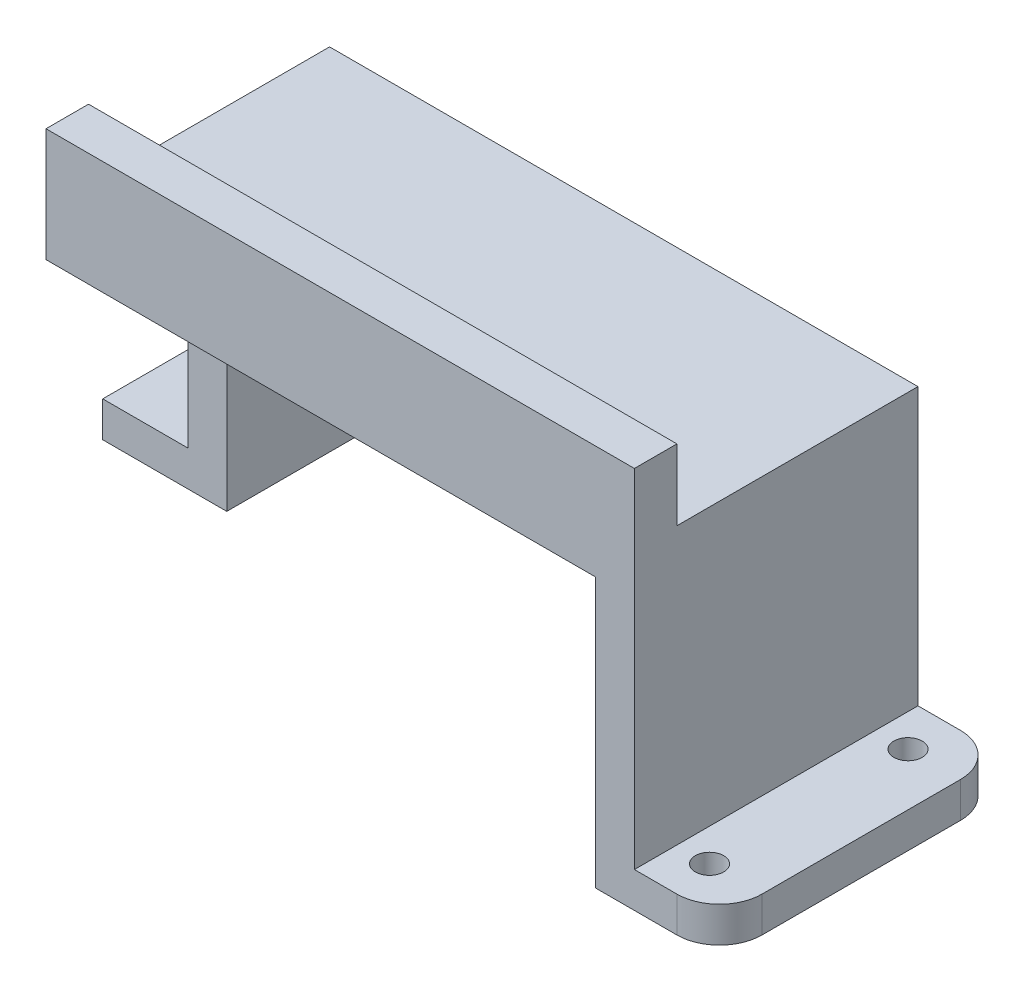
ISO-10303-21;
HEADER;
FILE_DESCRIPTION(('STEP AP214'),'2;1');
FILE_NAME('part.step','',(''),(''),'','','');
FILE_SCHEMA(('AUTOMOTIVE_DESIGN { 1 0 10303 214 1 1 1 1 }'));
ENDSEC;
DATA;
#1=APPLICATION_CONTEXT('core data for automotive mechanical design processes');
#2=APPLICATION_PROTOCOL_DEFINITION('international standard','automotive_design',2000,#1);
#3=PRODUCT_CONTEXT('',#1,'mechanical');
#4=PRODUCT('Part','Part','',(#3));
#5=PRODUCT_RELATED_PRODUCT_CATEGORY('part','',(#4));
#6=PRODUCT_DEFINITION_FORMATION('','',#4);
#7=PRODUCT_DEFINITION_CONTEXT('part definition',#1,'design');
#8=PRODUCT_DEFINITION('design','',#6,#7);
#9=PRODUCT_DEFINITION_SHAPE('','',#8);
#10=(LENGTH_UNIT() NAMED_UNIT(*) SI_UNIT(.MILLI.,.METRE.));
#11=(NAMED_UNIT(*) PLANE_ANGLE_UNIT() SI_UNIT($,.RADIAN.));
#12=(NAMED_UNIT(*) SI_UNIT($,.STERADIAN.) SOLID_ANGLE_UNIT());
#13=UNCERTAINTY_MEASURE_WITH_UNIT(LENGTH_MEASURE(1.E-05),#10,'distance_accuracy_value','');
#14=(GEOMETRIC_REPRESENTATION_CONTEXT(3) GLOBAL_UNCERTAINTY_ASSIGNED_CONTEXT((#13)) GLOBAL_UNIT_ASSIGNED_CONTEXT((#10,
#11,#12)) REPRESENTATION_CONTEXT('',''));
#15=CARTESIAN_POINT('',(0.,0.,0.));
#16=DIRECTION('',(0.,0.,1.));
#17=DIRECTION('',(1.,0.,0.));
#18=AXIS2_PLACEMENT_3D('',#15,#16,#17);
#19=CARTESIAN_POINT('',(-19.75,-20.,33.5));
#20=DIRECTION('',(0.,1.,0.));
#21=DIRECTION('',(0.,0.,1.));
#22=AXIS2_PLACEMENT_3D('',#19,#20,#21);
#23=PLANE('',#22);
#24=CARTESIAN_POINT('',(-22.05,-20.,16.5));
#25=DIRECTION('',(0.,1.,0.));
#26=DIRECTION('',(0.,0.,1.));
#27=AXIS2_PLACEMENT_3D('',#24,#25,#26);
#28=CIRCLE('',#27,1.);
#29=CARTESIAN_POINT('',(-22.05,-20.,17.5));
#30=VERTEX_POINT('',#29);
#31=EDGE_CURVE('E197',#30,#30,#28,.F.);
#32=ORIENTED_EDGE('',*,*,#31,.F.);
#33=EDGE_LOOP('',(#32));
#34=FACE_BOUND('',#33,.T.);
#35=DIRECTION('',(1.,0.,0.));
#36=VECTOR('',#35,1.);
#37=CARTESIAN_POINT('',(-25.75,-20.,13.5));
#38=LINE('',#37,#36);
#39=CARTESIAN_POINT('',(-22.75,-20.,13.5));
#40=VERTEX_POINT('',#39);
#41=CARTESIAN_POINT('',(-17.,-20.,13.5));
#42=VERTEX_POINT('',#41);
#43=EDGE_CURVE('E192',#40,#42,#38,.T.);
#44=ORIENTED_EDGE('',*,*,#43,.T.);
#45=DIRECTION('',(0.,0.,-1.));
#46=VECTOR('',#45,1.);
#47=CARTESIAN_POINT('',(-17.,-20.,33.5));
#48=LINE('',#47,#46);
#49=CARTESIAN_POINT('',(-17.,-20.,23.5));
#50=VERTEX_POINT('',#49);
#51=EDGE_CURVE('E299',#50,#42,#48,.T.);
#52=ORIENTED_EDGE('',*,*,#51,.F.);
#53=DIRECTION('',(1.,0.,0.));
#54=VECTOR('',#53,1.);
#55=CARTESIAN_POINT('',(-17.,-20.,23.5));
#56=LINE('',#55,#54);
#57=CARTESIAN_POINT('',(-25.75,-20.,23.5));
#58=VERTEX_POINT('',#57);
#59=EDGE_CURVE('E422',#58,#50,#56,.T.);
#60=ORIENTED_EDGE('',*,*,#59,.F.);
#61=DIRECTION('',(0.,0.,-1.));
#62=VECTOR('',#61,1.);
#63=CARTESIAN_POINT('',(-25.75,-20.,33.5));
#64=LINE('',#63,#62);
#65=CARTESIAN_POINT('',(-25.75,-20.,16.5));
#66=VERTEX_POINT('',#65);
#67=EDGE_CURVE('E59',#58,#66,#64,.T.);
#68=ORIENTED_EDGE('',*,*,#67,.T.);
#69=CARTESIAN_POINT('',(-22.75,-20.,16.5));
#70=DIRECTION('',(0.,1.,0.));
#71=DIRECTION('',(0.,0.,1.));
#72=AXIS2_PLACEMENT_3D('',#69,#70,#71);
#73=CIRCLE('',#72,3.);
#74=EDGE_CURVE('E45',#66,#40,#73,.F.);
#75=ORIENTED_EDGE('',*,*,#74,.T.);
#76=EDGE_LOOP('',(#44,#52,#60,#68,#75));
#77=FACE_BOUND('',#76,.T.);
#78=ADVANCED_FACE('F37',(#34,#77),#23,.F.);
#79=CARTESIAN_POINT('',(-25.75,-17.5,33.5));
#80=DIRECTION('',(0.,1.,0.));
#81=DIRECTION('',(0.,0.,1.));
#82=AXIS2_PLACEMENT_3D('',#79,#80,#81);
#83=PLANE('',#82);
#84=CARTESIAN_POINT('',(-22.05,-17.5,16.5));
#85=DIRECTION('',(0.,-1.,0.));
#86=DIRECTION('',(0.,0.,1.));
#87=AXIS2_PLACEMENT_3D('',#84,#85,#86);
#88=CIRCLE('',#87,1.);
#89=CARTESIAN_POINT('',(-22.05,-17.5,17.5));
#90=VERTEX_POINT('',#89);
#91=EDGE_CURVE('E201',#90,#90,#88,.T.);
#92=ORIENTED_EDGE('',*,*,#91,.T.);
#93=EDGE_LOOP('',(#92));
#94=FACE_BOUND('',#93,.T.);
#95=DIRECTION('',(0.,0.,1.));
#96=VECTOR('',#95,1.);
#97=CARTESIAN_POINT('',(-25.75,-17.5,33.5));
#98=LINE('',#97,#96);
#99=CARTESIAN_POINT('',(-25.75,-17.5,16.5));
#100=VERTEX_POINT('',#99);
#101=CARTESIAN_POINT('',(-25.75,-17.5,23.5));
#102=VERTEX_POINT('',#101);
#103=EDGE_CURVE('E193',#100,#102,#98,.T.);
#104=ORIENTED_EDGE('',*,*,#103,.T.);
#105=DIRECTION('',(1.,0.,0.));
#106=VECTOR('',#105,1.);
#107=CARTESIAN_POINT('',(-25.75,-17.5,23.5));
#108=LINE('',#107,#106);
#109=CARTESIAN_POINT('',(-19.75,-17.5,23.5));
#110=VERTEX_POINT('',#109);
#111=EDGE_CURVE('E51',#102,#110,#108,.T.);
#112=ORIENTED_EDGE('',*,*,#111,.T.);
#113=DIRECTION('',(0.,0.,1.));
#114=VECTOR('',#113,1.);
#115=CARTESIAN_POINT('',(-19.75,-17.5,33.5));
#116=LINE('',#115,#114);
#117=CARTESIAN_POINT('',(-19.75,-17.5,13.5));
#118=VERTEX_POINT('',#117);
#119=EDGE_CURVE('E176',#118,#110,#116,.T.);
#120=ORIENTED_EDGE('',*,*,#119,.F.);
#121=DIRECTION('',(1.,0.,0.));
#122=VECTOR('',#121,1.);
#123=CARTESIAN_POINT('',(-25.75,-17.5,13.5));
#124=LINE('',#123,#122);
#125=CARTESIAN_POINT('',(-22.75,-17.5,13.5));
#126=VERTEX_POINT('',#125);
#127=EDGE_CURVE('E185',#126,#118,#124,.T.);
#128=ORIENTED_EDGE('',*,*,#127,.F.);
#129=CARTESIAN_POINT('',(-22.75,-17.5,16.5));
#130=DIRECTION('',(0.,1.,0.));
#131=DIRECTION('',(0.,0.,1.));
#132=AXIS2_PLACEMENT_3D('',#129,#130,#131);
#133=CIRCLE('',#132,3.);
#134=EDGE_CURVE('E459',#126,#100,#133,.T.);
#135=ORIENTED_EDGE('',*,*,#134,.T.);
#136=EDGE_LOOP('',(#104,#112,#120,#128,#135));
#137=FACE_BOUND('',#136,.T.);
#138=ADVANCED_FACE('F196',(#94,#137),#83,.T.);
#139=CARTESIAN_POINT('',(-17.,-20.,33.5));
#140=DIRECTION('',(-1.,0.,0.));
#141=DIRECTION('',(0.,0.,1.));
#142=AXIS2_PLACEMENT_3D('',#139,#140,#141);
#143=PLANE('',#142);
#144=ORIENTED_EDGE('',*,*,#51,.T.);
#145=DIRECTION('',(0.,1.,0.));
#146=VECTOR('',#145,1.);
#147=CARTESIAN_POINT('',(-17.,-20.,13.5));
#148=LINE('',#147,#146);
#149=CARTESIAN_POINT('',(-17.,-0.999999999999999,13.5));
#150=VERTEX_POINT('',#149);
#151=EDGE_CURVE('E427',#42,#150,#148,.T.);
#152=ORIENTED_EDGE('',*,*,#151,.T.);
#153=DIRECTION('',(0.,0.,-1.));
#154=VECTOR('',#153,1.);
#155=CARTESIAN_POINT('',(-17.,-0.999999999999999,33.5));
#156=LINE('',#155,#154);
#157=CARTESIAN_POINT('',(-17.,-1.,23.5));
#158=VERTEX_POINT('',#157);
#159=EDGE_CURVE('E308',#158,#150,#156,.T.);
#160=ORIENTED_EDGE('',*,*,#159,.F.);
#161=DIRECTION('',(0.,1.,0.));
#162=VECTOR('',#161,1.);
#163=CARTESIAN_POINT('',(-17.,-20.,23.5));
#164=LINE('',#163,#162);
#165=EDGE_CURVE('E431',#50,#158,#164,.T.);
#166=ORIENTED_EDGE('',*,*,#165,.F.);
#167=EDGE_LOOP('',(#144,#152,#160,#166));
#168=FACE_BOUND('',#167,.T.);
#169=ADVANCED_FACE('F366',(#168),#143,.F.);
#170=CARTESIAN_POINT('',(-25.75,0.,0.));
#171=DIRECTION('',(1.,0.,0.));
#172=DIRECTION('',(0.,0.,1.));
#173=AXIS2_PLACEMENT_3D('',#170,#171,#172);
#174=PLANE('',#173);
#175=DIRECTION('',(0.,-1.,0.));
#176=VECTOR('',#175,1.);
#177=CARTESIAN_POINT('',(-25.75,0.,23.5));
#178=LINE('',#177,#176);
#179=EDGE_CURVE('E11',#102,#58,#178,.T.);
#180=ORIENTED_EDGE('',*,*,#179,.F.);
#181=ORIENTED_EDGE('',*,*,#103,.F.);
#182=DIRECTION('',(0.,1.,0.));
#183=VECTOR('',#182,1.);
#184=CARTESIAN_POINT('',(-25.75,-20.,16.5));
#185=LINE('',#184,#183);
#186=EDGE_CURVE('E461',#100,#66,#185,.F.);
#187=ORIENTED_EDGE('',*,*,#186,.T.);
#188=ORIENTED_EDGE('',*,*,#67,.F.);
#189=EDGE_LOOP('',(#180,#181,#187,#188));
#190=FACE_BOUND('',#189,.T.);
#191=ADVANCED_FACE('F379',(#190),#174,.F.);
#192=CARTESIAN_POINT('',(-19.75,2.,33.5));
#193=DIRECTION('',(0.,-1.,0.));
#194=DIRECTION('',(0.,0.,-1.));
#195=AXIS2_PLACEMENT_3D('',#192,#193,#194);
#196=PLANE('',#195);
#197=DIRECTION('',(0.,0.,-1.));
#198=VECTOR('',#197,1.);
#199=CARTESIAN_POINT('',(21.75,2.,33.5));
#200=LINE('',#199,#198);
#201=CARTESIAN_POINT('',(21.75,2.,30.5));
#202=VERTEX_POINT('',#201);
#203=CARTESIAN_POINT('',(21.75,2.,13.5));
#204=VERTEX_POINT('',#203);
#205=EDGE_CURVE('E234',#202,#204,#200,.T.);
#206=ORIENTED_EDGE('',*,*,#205,.T.);
#207=DIRECTION('',(-1.,0.,0.));
#208=VECTOR('',#207,1.);
#209=CARTESIAN_POINT('',(-19.75,2.,13.5));
#210=LINE('',#209,#208);
#211=CARTESIAN_POINT('',(-19.75,2.,13.5));
#212=VERTEX_POINT('',#211);
#213=EDGE_CURVE('E406',#204,#212,#210,.T.);
#214=ORIENTED_EDGE('',*,*,#213,.T.);
#215=DIRECTION('',(0.,0.,-1.));
#216=VECTOR('',#215,1.);
#217=CARTESIAN_POINT('',(-19.75,2.,33.5));
#218=LINE('',#217,#216);
#219=CARTESIAN_POINT('',(-19.75,2.,30.5));
#220=VERTEX_POINT('',#219);
#221=EDGE_CURVE('E178',#220,#212,#218,.T.);
#222=ORIENTED_EDGE('',*,*,#221,.F.);
#223=DIRECTION('',(-1.,0.,0.));
#224=VECTOR('',#223,1.);
#225=CARTESIAN_POINT('',(-19.75,2.,30.5));
#226=LINE('',#225,#224);
#227=EDGE_CURVE('E218',#202,#220,#226,.T.);
#228=ORIENTED_EDGE('',*,*,#227,.F.);
#229=EDGE_LOOP('',(#206,#214,#222,#228));
#230=FACE_BOUND('',#229,.T.);
#231=ADVANCED_FACE('F376',(#230),#196,.F.);
#232=CARTESIAN_POINT('',(21.75,-20.,33.5));
#233=DIRECTION('',(-1.,0.,0.));
#234=DIRECTION('',(0.,0.,1.));
#235=AXIS2_PLACEMENT_3D('',#232,#233,#234);
#236=PLANE('',#235);
#237=DIRECTION('',(0.,0.,1.));
#238=VECTOR('',#237,1.);
#239=CARTESIAN_POINT('',(21.75,-17.5,33.5));
#240=LINE('',#239,#238);
#241=CARTESIAN_POINT('',(21.75,-17.5,13.5));
#242=VERTEX_POINT('',#241);
#243=CARTESIAN_POINT('',(21.75,-17.5,33.5));
#244=VERTEX_POINT('',#243);
#245=EDGE_CURVE('E260',#242,#244,#240,.T.);
#246=ORIENTED_EDGE('',*,*,#245,.F.);
#247=DIRECTION('',(0.,1.,0.));
#248=VECTOR('',#247,1.);
#249=CARTESIAN_POINT('',(21.75,-20.,13.5));
#250=LINE('',#249,#248);
#251=EDGE_CURVE('E181',#242,#204,#250,.T.);
#252=ORIENTED_EDGE('',*,*,#251,.T.);
#253=ORIENTED_EDGE('',*,*,#205,.F.);
#254=DIRECTION('',(0.,-1.,0.));
#255=VECTOR('',#254,1.);
#256=CARTESIAN_POINT('',(21.75,7.,30.5));
#257=LINE('',#256,#255);
#258=CARTESIAN_POINT('',(21.75,7.,30.5));
#259=VERTEX_POINT('',#258);
#260=EDGE_CURVE('E238',#259,#202,#257,.T.);
#261=ORIENTED_EDGE('',*,*,#260,.F.);
#262=DIRECTION('',(0.,0.,-1.));
#263=VECTOR('',#262,1.);
#264=CARTESIAN_POINT('',(21.75,7.,33.5));
#265=LINE('',#264,#263);
#266=CARTESIAN_POINT('',(21.75,7.,33.5));
#267=VERTEX_POINT('',#266);
#268=EDGE_CURVE('E221',#267,#259,#265,.T.);
#269=ORIENTED_EDGE('',*,*,#268,.F.);
#270=DIRECTION('',(0.,1.,0.));
#271=VECTOR('',#270,1.);
#272=CARTESIAN_POINT('',(21.75,-20.,33.5));
#273=LINE('',#272,#271);
#274=EDGE_CURVE('E276',#244,#267,#273,.T.);
#275=ORIENTED_EDGE('',*,*,#274,.F.);
#276=EDGE_LOOP('',(#246,#252,#253,#261,#269,#275));
#277=FACE_BOUND('',#276,.T.);
#278=ADVANCED_FACE('F340',(#277),#236,.F.);
#279=CARTESIAN_POINT('',(-19.75,-20.,33.5));
#280=DIRECTION('',(1.,0.,0.));
#281=DIRECTION('',(0.,0.,-1.));
#282=AXIS2_PLACEMENT_3D('',#279,#280,#281);
#283=PLANE('',#282);
#284=ORIENTED_EDGE('',*,*,#221,.T.);
#285=DIRECTION('',(0.,1.,0.));
#286=VECTOR('',#285,1.);
#287=CARTESIAN_POINT('',(-19.75,-20.,13.5));
#288=LINE('',#287,#286);
#289=EDGE_CURVE('E171',#118,#212,#288,.T.);
#290=ORIENTED_EDGE('',*,*,#289,.F.);
#291=ORIENTED_EDGE('',*,*,#119,.T.);
#292=DIRECTION('',(0.,-1.,0.));
#293=VECTOR('',#292,1.);
#294=CARTESIAN_POINT('',(-19.75,-20.,23.5));
#295=LINE('',#294,#293);
#296=CARTESIAN_POINT('',(-19.75,-0.997333695089782,23.5));
#297=VERTEX_POINT('',#296);
#298=EDGE_CURVE('E409',#297,#110,#295,.T.);
#299=ORIENTED_EDGE('',*,*,#298,.F.);
#300=DIRECTION('',(0.,0.,1.));
#301=VECTOR('',#300,1.);
#302=CARTESIAN_POINT('',(-19.75,-0.99733369508978,33.5));
#303=LINE('',#302,#301);
#304=CARTESIAN_POINT('',(-19.75,-0.997333695089782,33.5));
#305=VERTEX_POINT('',#304);
#306=EDGE_CURVE('E408',#297,#305,#303,.T.);
#307=ORIENTED_EDGE('',*,*,#306,.T.);
#308=DIRECTION('',(0.,-1.,0.));
#309=VECTOR('',#308,1.);
#310=CARTESIAN_POINT('',(-19.75,-20.,33.5));
#311=LINE('',#310,#309);
#312=CARTESIAN_POINT('',(-19.75,7.,33.5));
#313=VERTEX_POINT('',#312);
#314=EDGE_CURVE('E206',#313,#305,#311,.T.);
#315=ORIENTED_EDGE('',*,*,#314,.F.);
#316=DIRECTION('',(0.,0.,1.));
#317=VECTOR('',#316,1.);
#318=CARTESIAN_POINT('',(-19.75,7.,33.5));
#319=LINE('',#318,#317);
#320=CARTESIAN_POINT('',(-19.75,7.,30.5));
#321=VERTEX_POINT('',#320);
#322=EDGE_CURVE('E214',#321,#313,#319,.T.);
#323=ORIENTED_EDGE('',*,*,#322,.F.);
#324=DIRECTION('',(0.,-1.,0.));
#325=VECTOR('',#324,1.);
#326=CARTESIAN_POINT('',(-19.75,7.,30.5));
#327=LINE('',#326,#325);
#328=EDGE_CURVE('E225',#321,#220,#327,.T.);
#329=ORIENTED_EDGE('',*,*,#328,.T.);
#330=EDGE_LOOP('',(#284,#290,#291,#299,#307,#315,#323,#329));
#331=FACE_BOUND('',#330,.T.);
#332=ADVANCED_FACE('F173',(#331),#283,.F.);
#333=CARTESIAN_POINT('',(-17.,-0.999999999999999,33.5));
#334=DIRECTION('',(0.,1.,0.));
#335=DIRECTION('',(-1.,0.,0.));
#336=AXIS2_PLACEMENT_3D('',#333,#334,#335);
#337=PLANE('',#336);
#338=ORIENTED_EDGE('',*,*,#159,.T.);
#339=DIRECTION('',(1.,0.,0.));
#340=VECTOR('',#339,1.);
#341=CARTESIAN_POINT('',(-17.,-0.999999999999999,13.5));
#342=LINE('',#341,#340);
#343=CARTESIAN_POINT('',(19.,-0.999999999999997,13.5));
#344=VERTEX_POINT('',#343);
#345=EDGE_CURVE('E436',#150,#344,#342,.T.);
#346=ORIENTED_EDGE('',*,*,#345,.T.);
#347=DIRECTION('',(0.,0.,-1.));
#348=VECTOR('',#347,1.);
#349=CARTESIAN_POINT('',(19.,-0.999999999999997,33.5));
#350=LINE('',#349,#348);
#351=CARTESIAN_POINT('',(19.,-0.999999999999997,33.5));
#352=VERTEX_POINT('',#351);
#353=EDGE_CURVE('E309',#352,#344,#350,.T.);
#354=ORIENTED_EDGE('',*,*,#353,.F.);
#355=DIRECTION('',(1.,0.,0.));
#356=VECTOR('',#355,1.);
#357=CARTESIAN_POINT('',(-17.,-0.999999999999999,33.5));
#358=LINE('',#357,#356);
#359=CARTESIAN_POINT('',(-17.,-1.,33.5));
#360=VERTEX_POINT('',#359);
#361=EDGE_CURVE('E320',#360,#352,#358,.T.);
#362=ORIENTED_EDGE('',*,*,#361,.F.);
#363=EDGE_CURVE('E305',#360,#158,#156,.T.);
#364=ORIENTED_EDGE('',*,*,#363,.T.);
#365=EDGE_LOOP('',(#338,#346,#354,#362,#364));
#366=FACE_BOUND('',#365,.T.);
#367=ADVANCED_FACE('F375',(#366),#337,.F.);
#368=CARTESIAN_POINT('',(19.,-20.,33.5));
#369=DIRECTION('',(1.,0.,0.));
#370=DIRECTION('',(0.,0.,-1.));
#371=AXIS2_PLACEMENT_3D('',#368,#369,#370);
#372=PLANE('',#371);
#373=ORIENTED_EDGE('',*,*,#353,.T.);
#374=DIRECTION('',(0.,-1.,0.));
#375=VECTOR('',#374,1.);
#376=CARTESIAN_POINT('',(19.,-20.,13.5));
#377=LINE('',#376,#375);
#378=CARTESIAN_POINT('',(19.,-20.,13.5));
#379=VERTEX_POINT('',#378);
#380=EDGE_CURVE('E439',#344,#379,#377,.T.);
#381=ORIENTED_EDGE('',*,*,#380,.T.);
#382=DIRECTION('',(0.,0.,-1.));
#383=VECTOR('',#382,1.);
#384=CARTESIAN_POINT('',(19.,-20.,33.5));
#385=LINE('',#384,#383);
#386=CARTESIAN_POINT('',(19.,-20.,33.5));
#387=VERTEX_POINT('',#386);
#388=EDGE_CURVE('E312',#387,#379,#385,.T.);
#389=ORIENTED_EDGE('',*,*,#388,.F.);
#390=DIRECTION('',(0.,-1.,0.));
#391=VECTOR('',#390,1.);
#392=CARTESIAN_POINT('',(19.,-20.,33.5));
#393=LINE('',#392,#391);
#394=EDGE_CURVE('E318',#352,#387,#393,.T.);
#395=ORIENTED_EDGE('',*,*,#394,.F.);
#396=EDGE_LOOP('',(#373,#381,#389,#395));
#397=FACE_BOUND('',#396,.T.);
#398=ADVANCED_FACE('F358',(#397),#372,.F.);
#399=CARTESIAN_POINT('',(19.,-20.,33.5));
#400=DIRECTION('',(0.,1.,0.));
#401=DIRECTION('',(0.,0.,1.));
#402=AXIS2_PLACEMENT_3D('',#399,#400,#401);
#403=PLANE('',#402);
#404=CARTESIAN_POINT('',(24.05,-20.,30.5));
#405=DIRECTION('',(0.,1.,0.));
#406=DIRECTION('',(0.,0.,1.));
#407=AXIS2_PLACEMENT_3D('',#404,#405,#406);
#408=CIRCLE('',#407,1.);
#409=CARTESIAN_POINT('',(24.05,-20.,31.5));
#410=VERTEX_POINT('',#409);
#411=EDGE_CURVE('E247',#410,#410,#408,.T.);
#412=ORIENTED_EDGE('',*,*,#411,.T.);
#413=EDGE_LOOP('',(#412));
#414=FACE_BOUND('',#413,.T.);
#415=CARTESIAN_POINT('',(24.05,-20.,16.5));
#416=DIRECTION('',(0.,1.,0.));
#417=DIRECTION('',(0.,0.,1.));
#418=AXIS2_PLACEMENT_3D('',#415,#416,#417);
#419=CIRCLE('',#418,1.);
#420=CARTESIAN_POINT('',(24.05,-20.,17.5));
#421=VERTEX_POINT('',#420);
#422=EDGE_CURVE('E255',#421,#421,#419,.T.);
#423=ORIENTED_EDGE('',*,*,#422,.T.);
#424=EDGE_LOOP('',(#423));
#425=FACE_BOUND('',#424,.T.);
#426=ORIENTED_EDGE('',*,*,#388,.T.);
#427=DIRECTION('',(-1.,0.,0.));
#428=VECTOR('',#427,1.);
#429=CARTESIAN_POINT('',(27.75,-20.,13.5));
#430=LINE('',#429,#428);
#431=CARTESIAN_POINT('',(24.75,-20.,13.5));
#432=VERTEX_POINT('',#431);
#433=EDGE_CURVE('E267',#432,#379,#430,.T.);
#434=ORIENTED_EDGE('',*,*,#433,.F.);
#435=CARTESIAN_POINT('',(24.75,-20.,16.5));
#436=DIRECTION('',(0.,1.,0.));
#437=DIRECTION('',(0.,0.,1.));
#438=AXIS2_PLACEMENT_3D('',#435,#436,#437);
#439=CIRCLE('',#438,3.);
#440=CARTESIAN_POINT('',(27.75,-20.,16.5));
#441=VERTEX_POINT('',#440);
#442=EDGE_CURVE('E295',#432,#441,#439,.F.);
#443=ORIENTED_EDGE('',*,*,#442,.T.);
#444=DIRECTION('',(0.,0.,-1.));
#445=VECTOR('',#444,1.);
#446=CARTESIAN_POINT('',(27.75,-20.,33.5));
#447=LINE('',#446,#445);
#448=CARTESIAN_POINT('',(27.75,-20.,30.5));
#449=VERTEX_POINT('',#448);
#450=EDGE_CURVE('E264',#449,#441,#447,.T.);
#451=ORIENTED_EDGE('',*,*,#450,.F.);
#452=CARTESIAN_POINT('',(24.75,-20.,30.5));
#453=DIRECTION('',(0.,1.,0.));
#454=DIRECTION('',(0.,0.,1.));
#455=AXIS2_PLACEMENT_3D('',#452,#453,#454);
#456=CIRCLE('',#455,3.);
#457=CARTESIAN_POINT('',(24.75,-20.,33.5));
#458=VERTEX_POINT('',#457);
#459=EDGE_CURVE('E293',#449,#458,#456,.F.);
#460=ORIENTED_EDGE('',*,*,#459,.T.);
#461=DIRECTION('',(1.,0.,0.));
#462=VECTOR('',#461,1.);
#463=CARTESIAN_POINT('',(19.,-20.,33.5));
#464=LINE('',#463,#462);
#465=EDGE_CURVE('E315',#387,#458,#464,.T.);
#466=ORIENTED_EDGE('',*,*,#465,.F.);
#467=EDGE_LOOP('',(#426,#434,#443,#451,#460,#466));
#468=FACE_BOUND('',#467,.T.);
#469=ADVANCED_FACE('F351',(#414,#425,#468),#403,.F.);
#470=CARTESIAN_POINT('',(0.,0.,33.5));
#471=DIRECTION('',(0.,0.,-1.));
#472=DIRECTION('',(-1.,0.,0.));
#473=AXIS2_PLACEMENT_3D('',#470,#471,#472);
#474=PLANE('',#473);
#475=DIRECTION('',(-1.,0.,0.));
#476=VECTOR('',#475,1.);
#477=CARTESIAN_POINT('',(-17.,-0.997333695089782,33.5));
#478=LINE('',#477,#476);
#479=CARTESIAN_POINT('',(-17.,-0.997333695089782,33.5));
#480=VERTEX_POINT('',#479);
#481=EDGE_CURVE('E349',#480,#305,#478,.T.);
#482=ORIENTED_EDGE('',*,*,#481,.F.);
#483=DIRECTION('',(0.,1.,0.));
#484=VECTOR('',#483,1.);
#485=CARTESIAN_POINT('',(-17.,-20.,33.5));
#486=LINE('',#485,#484);
#487=EDGE_CURVE('E425',#360,#480,#486,.T.);
#488=ORIENTED_EDGE('',*,*,#487,.F.);
#489=ORIENTED_EDGE('',*,*,#361,.T.);
#490=ORIENTED_EDGE('',*,*,#394,.T.);
#491=ORIENTED_EDGE('',*,*,#465,.T.);
#492=DIRECTION('',(0.,-1.,0.));
#493=VECTOR('',#492,1.);
#494=CARTESIAN_POINT('',(24.75,0.,33.5));
#495=LINE('',#494,#493);
#496=CARTESIAN_POINT('',(24.75,-17.5,33.5));
#497=VERTEX_POINT('',#496);
#498=EDGE_CURVE('E297',#458,#497,#495,.F.);
#499=ORIENTED_EDGE('',*,*,#498,.T.);
#500=DIRECTION('',(-1.,0.,0.));
#501=VECTOR('',#500,1.);
#502=CARTESIAN_POINT('',(27.75,-17.5,33.5));
#503=LINE('',#502,#501);
#504=EDGE_CURVE('E282',#497,#244,#503,.T.);
#505=ORIENTED_EDGE('',*,*,#504,.T.);
#506=ORIENTED_EDGE('',*,*,#274,.T.);
#507=DIRECTION('',(1.,0.,0.));
#508=VECTOR('',#507,1.);
#509=CARTESIAN_POINT('',(-19.75,7.,33.5));
#510=LINE('',#509,#508);
#511=EDGE_CURVE('E217',#313,#267,#510,.T.);
#512=ORIENTED_EDGE('',*,*,#511,.F.);
#513=ORIENTED_EDGE('',*,*,#314,.T.);
#514=EDGE_LOOP('',(#482,#488,#489,#490,#491,#499,#505,#506,#512,#513));
#515=FACE_BOUND('',#514,.T.);
#516=ADVANCED_FACE('F348',(#515),#474,.F.);
#517=CARTESIAN_POINT('',(27.75,-20.,13.5));
#518=DIRECTION('',(0.,0.,1.));
#519=DIRECTION('',(1.,0.,0.));
#520=AXIS2_PLACEMENT_3D('',#517,#518,#519);
#521=PLANE('',#520);
#522=DIRECTION('',(-1.,0.,0.));
#523=VECTOR('',#522,1.);
#524=CARTESIAN_POINT('',(27.75,-17.5,13.5));
#525=LINE('',#524,#523);
#526=CARTESIAN_POINT('',(24.75,-17.5,13.5));
#527=VERTEX_POINT('',#526);
#528=EDGE_CURVE('E270',#527,#242,#525,.T.);
#529=ORIENTED_EDGE('',*,*,#528,.F.);
#530=DIRECTION('',(0.,1.,0.));
#531=VECTOR('',#530,1.);
#532=CARTESIAN_POINT('',(24.75,-20.,13.5));
#533=LINE('',#532,#531);
#534=EDGE_CURVE('E290',#527,#432,#533,.F.);
#535=ORIENTED_EDGE('',*,*,#534,.T.);
#536=ORIENTED_EDGE('',*,*,#433,.T.);
#537=ORIENTED_EDGE('',*,*,#380,.F.);
#538=ORIENTED_EDGE('',*,*,#345,.F.);
#539=ORIENTED_EDGE('',*,*,#151,.F.);
#540=ORIENTED_EDGE('',*,*,#43,.F.);
#541=DIRECTION('',(0.,1.,0.));
#542=VECTOR('',#541,1.);
#543=CARTESIAN_POINT('',(-22.75,-17.5,13.5));
#544=LINE('',#543,#542);
#545=EDGE_CURVE('E190',#40,#126,#544,.T.);
#546=ORIENTED_EDGE('',*,*,#545,.T.);
#547=ORIENTED_EDGE('',*,*,#127,.T.);
#548=ORIENTED_EDGE('',*,*,#289,.T.);
#549=ORIENTED_EDGE('',*,*,#213,.F.);
#550=ORIENTED_EDGE('',*,*,#251,.F.);
#551=EDGE_LOOP('',(#529,#535,#536,#537,#538,#539,#540,#546,#547,#548,#549,#550));
#552=FACE_BOUND('',#551,.T.);
#553=ADVANCED_FACE('F187',(#552),#521,.F.);
#554=CARTESIAN_POINT('',(27.75,-17.5,33.5));
#555=DIRECTION('',(0.,-1.,0.));
#556=DIRECTION('',(0.,0.,-1.));
#557=AXIS2_PLACEMENT_3D('',#554,#555,#556);
#558=PLANE('',#557);
#559=CARTESIAN_POINT('',(24.05,-17.5,30.5));
#560=DIRECTION('',(0.,1.,0.));
#561=DIRECTION('',(0.,0.,1.));
#562=AXIS2_PLACEMENT_3D('',#559,#560,#561);
#563=CIRCLE('',#562,1.);
#564=CARTESIAN_POINT('',(24.05,-17.5,31.5));
#565=VERTEX_POINT('',#564);
#566=EDGE_CURVE('E228',#565,#565,#563,.T.);
#567=ORIENTED_EDGE('',*,*,#566,.F.);
#568=EDGE_LOOP('',(#567));
#569=FACE_BOUND('',#568,.T.);
#570=CARTESIAN_POINT('',(24.05,-17.5,16.5));
#571=DIRECTION('',(0.,1.,0.));
#572=DIRECTION('',(0.,0.,1.));
#573=AXIS2_PLACEMENT_3D('',#570,#571,#572);
#574=CIRCLE('',#573,1.);
#575=CARTESIAN_POINT('',(24.05,-17.5,17.5));
#576=VERTEX_POINT('',#575);
#577=EDGE_CURVE('E251',#576,#576,#574,.T.);
#578=ORIENTED_EDGE('',*,*,#577,.F.);
#579=EDGE_LOOP('',(#578));
#580=FACE_BOUND('',#579,.T.);
#581=DIRECTION('',(0.,0.,1.));
#582=VECTOR('',#581,1.);
#583=CARTESIAN_POINT('',(27.75,-17.5,33.5));
#584=LINE('',#583,#582);
#585=CARTESIAN_POINT('',(27.75,-17.5,16.5));
#586=VERTEX_POINT('',#585);
#587=CARTESIAN_POINT('',(27.75,-17.5,30.5));
#588=VERTEX_POINT('',#587);
#589=EDGE_CURVE('E261',#586,#588,#584,.T.);
#590=ORIENTED_EDGE('',*,*,#589,.F.);
#591=CARTESIAN_POINT('',(24.75,-17.5,16.5));
#592=DIRECTION('',(0.,-1.,0.));
#593=DIRECTION('',(0.,0.,-1.));
#594=AXIS2_PLACEMENT_3D('',#591,#592,#593);
#595=CIRCLE('',#594,3.);
#596=EDGE_CURVE('E288',#586,#527,#595,.F.);
#597=ORIENTED_EDGE('',*,*,#596,.T.);
#598=ORIENTED_EDGE('',*,*,#528,.T.);
#599=ORIENTED_EDGE('',*,*,#245,.T.);
#600=ORIENTED_EDGE('',*,*,#504,.F.);
#601=CARTESIAN_POINT('',(24.75,-17.5,30.5));
#602=DIRECTION('',(0.,-1.,0.));
#603=DIRECTION('',(0.,0.,-1.));
#604=AXIS2_PLACEMENT_3D('',#601,#602,#603);
#605=CIRCLE('',#604,3.);
#606=EDGE_CURVE('E286',#497,#588,#605,.F.);
#607=ORIENTED_EDGE('',*,*,#606,.T.);
#608=EDGE_LOOP('',(#590,#597,#598,#599,#600,#607));
#609=FACE_BOUND('',#608,.T.);
#610=ADVANCED_FACE('F335',(#569,#580,#609),#558,.F.);
#611=CARTESIAN_POINT('',(27.75,0.,0.));
#612=DIRECTION('',(-1.,0.,0.));
#613=DIRECTION('',(0.,0.,1.));
#614=AXIS2_PLACEMENT_3D('',#611,#612,#613);
#615=PLANE('',#614);
#616=ORIENTED_EDGE('',*,*,#450,.T.);
#617=DIRECTION('',(0.,1.,0.));
#618=VECTOR('',#617,1.);
#619=CARTESIAN_POINT('',(27.75,0.,16.5));
#620=LINE('',#619,#618);
#621=EDGE_CURVE('E285',#441,#586,#620,.T.);
#622=ORIENTED_EDGE('',*,*,#621,.T.);
#623=ORIENTED_EDGE('',*,*,#589,.T.);
#624=DIRECTION('',(0.,-1.,0.));
#625=VECTOR('',#624,1.);
#626=CARTESIAN_POINT('',(27.75,0.,30.5));
#627=LINE('',#626,#625);
#628=EDGE_CURVE('E399',#588,#449,#627,.T.);
#629=ORIENTED_EDGE('',*,*,#628,.T.);
#630=EDGE_LOOP('',(#616,#622,#623,#629));
#631=FACE_BOUND('',#630,.T.);
#632=ADVANCED_FACE('F402',(#631),#615,.F.);
#633=CARTESIAN_POINT('',(24.05,-20.00005,16.5));
#634=DIRECTION('',(0.,1.,0.));
#635=DIRECTION('',(0.,0.,1.));
#636=AXIS2_PLACEMENT_3D('',#633,#634,#635);
#637=CYLINDRICAL_SURFACE('',#636,1.);
#638=ORIENTED_EDGE('',*,*,#577,.T.);
#639=EDGE_LOOP('',(#638));
#640=FACE_BOUND('',#639,.T.);
#641=ORIENTED_EDGE('',*,*,#422,.F.);
#642=EDGE_LOOP('',(#641));
#643=FACE_BOUND('',#642,.T.);
#644=ADVANCED_FACE('F490',(#640,#643),#637,.F.);
#645=CARTESIAN_POINT('',(24.05,-20.00005,30.5));
#646=DIRECTION('',(0.,1.,0.));
#647=DIRECTION('',(0.,0.,1.));
#648=AXIS2_PLACEMENT_3D('',#645,#646,#647);
#649=CYLINDRICAL_SURFACE('',#648,1.);
#650=ORIENTED_EDGE('',*,*,#566,.T.);
#651=EDGE_LOOP('',(#650));
#652=FACE_BOUND('',#651,.T.);
#653=ORIENTED_EDGE('',*,*,#411,.F.);
#654=EDGE_LOOP('',(#653));
#655=FACE_BOUND('',#654,.T.);
#656=ADVANCED_FACE('F386',(#652,#655),#649,.F.);
#657=CARTESIAN_POINT('',(24.75,0.,16.5));
#658=DIRECTION('',(0.,1.,0.));
#659=DIRECTION('',(0.,0.,1.));
#660=AXIS2_PLACEMENT_3D('',#657,#658,#659);
#661=CYLINDRICAL_SURFACE('',#660,3.);
#662=ORIENTED_EDGE('',*,*,#442,.F.);
#663=ORIENTED_EDGE('',*,*,#534,.F.);
#664=ORIENTED_EDGE('',*,*,#596,.F.);
#665=ORIENTED_EDGE('',*,*,#621,.F.);
#666=EDGE_LOOP('',(#662,#663,#664,#665));
#667=FACE_BOUND('',#666,.T.);
#668=ADVANCED_FACE('F383',(#667),#661,.T.);
#669=CARTESIAN_POINT('',(24.75,0.,30.5));
#670=DIRECTION('',(0.,-1.,0.));
#671=DIRECTION('',(0.,0.,-1.));
#672=AXIS2_PLACEMENT_3D('',#669,#670,#671);
#673=CYLINDRICAL_SURFACE('',#672,3.);
#674=ORIENTED_EDGE('',*,*,#606,.F.);
#675=ORIENTED_EDGE('',*,*,#498,.F.);
#676=ORIENTED_EDGE('',*,*,#459,.F.);
#677=ORIENTED_EDGE('',*,*,#628,.F.);
#678=EDGE_LOOP('',(#674,#675,#676,#677));
#679=FACE_BOUND('',#678,.T.);
#680=ADVANCED_FACE('F385',(#679),#673,.T.);
#681=CARTESIAN_POINT('',(-19.75,7.,30.5));
#682=DIRECTION('',(0.,0.,1.));
#683=DIRECTION('',(1.,0.,0.));
#684=AXIS2_PLACEMENT_3D('',#681,#682,#683);
#685=PLANE('',#684);
#686=ORIENTED_EDGE('',*,*,#227,.T.);
#687=ORIENTED_EDGE('',*,*,#328,.F.);
#688=DIRECTION('',(-1.,0.,0.));
#689=VECTOR('',#688,1.);
#690=CARTESIAN_POINT('',(-19.75,7.,30.5));
#691=LINE('',#690,#689);
#692=EDGE_CURVE('E223',#259,#321,#691,.T.);
#693=ORIENTED_EDGE('',*,*,#692,.F.);
#694=ORIENTED_EDGE('',*,*,#260,.T.);
#695=EDGE_LOOP('',(#686,#687,#693,#694));
#696=FACE_BOUND('',#695,.T.);
#697=ADVANCED_FACE('F389',(#696),#685,.F.);
#698=CARTESIAN_POINT('',(0.,7.,0.));
#699=DIRECTION('',(0.,-1.,0.));
#700=DIRECTION('',(0.,0.,-1.));
#701=AXIS2_PLACEMENT_3D('',#698,#699,#700);
#702=PLANE('',#701);
#703=ORIENTED_EDGE('',*,*,#322,.T.);
#704=ORIENTED_EDGE('',*,*,#511,.T.);
#705=ORIENTED_EDGE('',*,*,#268,.T.);
#706=ORIENTED_EDGE('',*,*,#692,.T.);
#707=EDGE_LOOP('',(#703,#704,#705,#706));
#708=FACE_BOUND('',#707,.T.);
#709=ADVANCED_FACE('F345',(#708),#702,.F.);
#710=CARTESIAN_POINT('',(-22.05,-20.00005,16.5));
#711=DIRECTION('',(0.,1.,0.));
#712=DIRECTION('',(0.,0.,1.));
#713=AXIS2_PLACEMENT_3D('',#710,#711,#712);
#714=CYLINDRICAL_SURFACE('',#713,1.);
#715=ORIENTED_EDGE('',*,*,#91,.F.);
#716=EDGE_LOOP('',(#715));
#717=FACE_BOUND('',#716,.T.);
#718=ORIENTED_EDGE('',*,*,#31,.T.);
#719=EDGE_LOOP('',(#718));
#720=FACE_BOUND('',#719,.T.);
#721=ADVANCED_FACE('F480',(#717,#720),#714,.F.);
#722=CARTESIAN_POINT('',(-22.75,-20.,16.5));
#723=DIRECTION('',(0.,-1.,0.));
#724=DIRECTION('',(0.,0.,-1.));
#725=AXIS2_PLACEMENT_3D('',#722,#723,#724);
#726=CYLINDRICAL_SURFACE('',#725,3.);
#727=ORIENTED_EDGE('',*,*,#74,.F.);
#728=ORIENTED_EDGE('',*,*,#186,.F.);
#729=ORIENTED_EDGE('',*,*,#134,.F.);
#730=ORIENTED_EDGE('',*,*,#545,.F.);
#731=EDGE_LOOP('',(#727,#728,#729,#730));
#732=FACE_BOUND('',#731,.T.);
#733=ADVANCED_FACE('F39',(#732),#726,.T.);
#734=CARTESIAN_POINT('',(-17.,-20.,23.5));
#735=DIRECTION('',(1.,0.,0.));
#736=DIRECTION('',(0.,0.,-1.));
#737=AXIS2_PLACEMENT_3D('',#734,#735,#736);
#738=PLANE('',#737);
#739=ORIENTED_EDGE('',*,*,#487,.T.);
#740=DIRECTION('',(0.,0.,1.));
#741=VECTOR('',#740,1.);
#742=CARTESIAN_POINT('',(-17.,-0.997333695089782,23.5));
#743=LINE('',#742,#741);
#744=CARTESIAN_POINT('',(-17.,-0.997333695089782,23.5));
#745=VERTEX_POINT('',#744);
#746=EDGE_CURVE('E419',#745,#480,#743,.T.);
#747=ORIENTED_EDGE('',*,*,#746,.F.);
#748=EDGE_CURVE('E424',#158,#745,#164,.T.);
#749=ORIENTED_EDGE('',*,*,#748,.F.);
#750=ORIENTED_EDGE('',*,*,#363,.F.);
#751=EDGE_LOOP('',(#739,#747,#749,#750));
#752=FACE_BOUND('',#751,.T.);
#753=ADVANCED_FACE('F469',(#752),#738,.F.);
#754=CARTESIAN_POINT('',(-17.,-0.997333695089782,23.5));
#755=DIRECTION('',(0.,1.,0.));
#756=DIRECTION('',(0.,0.,1.));
#757=AXIS2_PLACEMENT_3D('',#754,#755,#756);
#758=PLANE('',#757);
#759=DIRECTION('',(-1.,0.,0.));
#760=VECTOR('',#759,1.);
#761=CARTESIAN_POINT('',(-17.,-0.997333695089782,23.5));
#762=LINE('',#761,#760);
#763=EDGE_CURVE('E429',#745,#297,#762,.T.);
#764=ORIENTED_EDGE('',*,*,#763,.F.);
#765=ORIENTED_EDGE('',*,*,#746,.T.);
#766=ORIENTED_EDGE('',*,*,#481,.T.);
#767=ORIENTED_EDGE('',*,*,#306,.F.);
#768=EDGE_LOOP('',(#764,#765,#766,#767));
#769=FACE_BOUND('',#768,.T.);
#770=ADVANCED_FACE('F470',(#769),#758,.F.);
#771=CARTESIAN_POINT('',(0.,0.,23.5));
#772=DIRECTION('',(0.,0.,1.));
#773=DIRECTION('',(1.,0.,0.));
#774=AXIS2_PLACEMENT_3D('',#771,#772,#773);
#775=PLANE('',#774);
#776=ORIENTED_EDGE('',*,*,#298,.T.);
#777=ORIENTED_EDGE('',*,*,#111,.F.);
#778=ORIENTED_EDGE('',*,*,#179,.T.);
#779=ORIENTED_EDGE('',*,*,#59,.T.);
#780=ORIENTED_EDGE('',*,*,#165,.T.);
#781=ORIENTED_EDGE('',*,*,#748,.T.);
#782=ORIENTED_EDGE('',*,*,#763,.T.);
#783=EDGE_LOOP('',(#776,#777,#778,#779,#780,#781,#782));
#784=FACE_BOUND('',#783,.T.);
#785=ADVANCED_FACE('F466',(#784),#775,.T.);
#786=CLOSED_SHELL('',(#78,#138,#169,#191,#231,#278,#332,#367,#398,#469,#516,#553,#610,#632,#644,
#656,#668,#680,#697,#709,#721,#733,#753,#770,#785));
#787=MANIFOLD_SOLID_BREP('B2',#786);
#788=ADVANCED_BREP_SHAPE_REPRESENTATION('',(#18,#787),#14);
#789=SHAPE_DEFINITION_REPRESENTATION(#9,#788);
ENDSEC;
END-ISO-10303-21;
